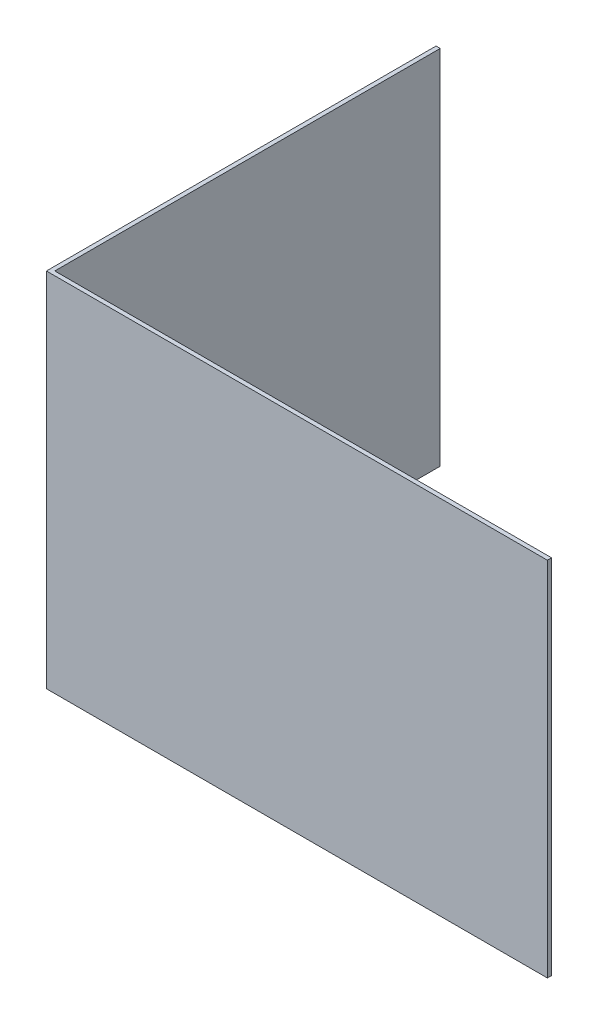
ISO-10303-21;
HEADER;
FILE_DESCRIPTION(('STEP AP214'),'2;1');
FILE_NAME('part.step','',(''),(''),'','','');
FILE_SCHEMA(('AUTOMOTIVE_DESIGN { 1 0 10303 214 1 1 1 1 }'));
ENDSEC;
DATA;
#1=APPLICATION_CONTEXT('core data for automotive mechanical design processes');
#2=APPLICATION_PROTOCOL_DEFINITION('international standard','automotive_design',2000,#1);
#3=PRODUCT_CONTEXT('',#1,'mechanical');
#4=PRODUCT('Part','Part','',(#3));
#5=PRODUCT_RELATED_PRODUCT_CATEGORY('part','',(#4));
#6=PRODUCT_DEFINITION_FORMATION('','',#4);
#7=PRODUCT_DEFINITION_CONTEXT('part definition',#1,'design');
#8=PRODUCT_DEFINITION('design','',#6,#7);
#9=PRODUCT_DEFINITION_SHAPE('','',#8);
#10=(LENGTH_UNIT() NAMED_UNIT(*) SI_UNIT(.MILLI.,.METRE.));
#11=(NAMED_UNIT(*) PLANE_ANGLE_UNIT() SI_UNIT($,.RADIAN.));
#12=(NAMED_UNIT(*) SI_UNIT($,.STERADIAN.) SOLID_ANGLE_UNIT());
#13=UNCERTAINTY_MEASURE_WITH_UNIT(LENGTH_MEASURE(1.E-05),#10,'distance_accuracy_value','');
#14=(GEOMETRIC_REPRESENTATION_CONTEXT(3) GLOBAL_UNCERTAINTY_ASSIGNED_CONTEXT((#13)) GLOBAL_UNIT_ASSIGNED_CONTEXT((#10,
#11,#12)) REPRESENTATION_CONTEXT('',''));
#15=CARTESIAN_POINT('',(0.,0.,0.));
#16=DIRECTION('',(0.,0.,1.));
#17=DIRECTION('',(1.,0.,0.));
#18=AXIS2_PLACEMENT_3D('',#15,#16,#17);
#19=CARTESIAN_POINT('',(-47.7659912562796,130.,-15.4658457131801));
#20=DIRECTION('',(0.,0.,1.));
#21=DIRECTION('',(1.,0.,0.));
#22=AXIS2_PLACEMENT_3D('',#19,#20,#21);
#23=PLANE('',#22);
#24=DIRECTION('',(-1.,0.,0.));
#25=VECTOR('',#24,1.);
#26=CARTESIAN_POINT('',(-47.7659912562796,0.,-15.4658457131801));
#27=LINE('',#26,#25);
#28=CARTESIAN_POINT('',(-47.7659912562796,0.,-15.4658457131801));
#29=VERTEX_POINT('',#28);
#30=CARTESIAN_POINT('',(-49.2659912562796,0.,-15.4658457131801));
#31=VERTEX_POINT('',#30);
#32=EDGE_CURVE('E138',#29,#31,#27,.T.);
#33=ORIENTED_EDGE('',*,*,#32,.T.);
#34=DIRECTION('',(0.,-1.,0.));
#35=VECTOR('',#34,1.);
#36=CARTESIAN_POINT('',(-49.2659912562796,130.,-15.4658457131801));
#37=LINE('',#36,#35);
#38=CARTESIAN_POINT('',(-49.2659912562796,130.,-15.4658457131801));
#39=VERTEX_POINT('',#38);
#40=EDGE_CURVE('E11',#39,#31,#37,.T.);
#41=ORIENTED_EDGE('',*,*,#40,.F.);
#42=DIRECTION('',(-1.,0.,0.));
#43=VECTOR('',#42,1.);
#44=CARTESIAN_POINT('',(-47.7659912562796,130.,-15.4658457131801));
#45=LINE('',#44,#43);
#46=CARTESIAN_POINT('',(-47.7659912562796,130.,-15.4658457131801));
#47=VERTEX_POINT('',#46);
#48=EDGE_CURVE('E154',#47,#39,#45,.T.);
#49=ORIENTED_EDGE('',*,*,#48,.F.);
#50=DIRECTION('',(0.,-1.,0.));
#51=VECTOR('',#50,1.);
#52=CARTESIAN_POINT('',(-47.7659912562796,130.,-15.4658457131801));
#53=LINE('',#52,#51);
#54=EDGE_CURVE('E134',#47,#29,#53,.T.);
#55=ORIENTED_EDGE('',*,*,#54,.T.);
#56=EDGE_LOOP('',(#33,#41,#49,#55));
#57=FACE_BOUND('',#56,.T.);
#58=ADVANCED_FACE('F49',(#57),#23,.F.);
#59=CARTESIAN_POINT('',(-49.2659912562796,130.,-15.4658457131801));
#60=DIRECTION('',(1.,0.,0.));
#61=DIRECTION('',(0.,0.,-1.));
#62=AXIS2_PLACEMENT_3D('',#59,#60,#61);
#63=PLANE('',#62);
#64=DIRECTION('',(0.,0.,1.));
#65=VECTOR('',#64,1.);
#66=CARTESIAN_POINT('',(-49.2659912562796,0.,-15.4658457131801));
#67=LINE('',#66,#65);
#68=CARTESIAN_POINT('',(-49.2659912562796,0.,124.53415428682));
#69=VERTEX_POINT('',#68);
#70=EDGE_CURVE('E142',#31,#69,#67,.T.);
#71=ORIENTED_EDGE('',*,*,#70,.T.);
#72=DIRECTION('',(0.,-1.,0.));
#73=VECTOR('',#72,1.);
#74=CARTESIAN_POINT('',(-49.2659912562796,130.,124.53415428682));
#75=LINE('',#74,#73);
#76=CARTESIAN_POINT('',(-49.2659912562796,130.,124.53415428682));
#77=VERTEX_POINT('',#76);
#78=EDGE_CURVE('E58',#77,#69,#75,.T.);
#79=ORIENTED_EDGE('',*,*,#78,.F.);
#80=DIRECTION('',(0.,0.,1.));
#81=VECTOR('',#80,1.);
#82=CARTESIAN_POINT('',(-49.2659912562796,130.,-15.4658457131801));
#83=LINE('',#82,#81);
#84=EDGE_CURVE('E103',#39,#77,#83,.T.);
#85=ORIENTED_EDGE('',*,*,#84,.F.);
#86=ORIENTED_EDGE('',*,*,#40,.T.);
#87=EDGE_LOOP('',(#71,#79,#85,#86));
#88=FACE_BOUND('',#87,.T.);
#89=ADVANCED_FACE('F182',(#88),#63,.F.);
#90=CARTESIAN_POINT('',(-49.2659912562796,130.,124.53415428682));
#91=DIRECTION('',(0.,0.,-1.));
#92=DIRECTION('',(-1.,0.,0.));
#93=AXIS2_PLACEMENT_3D('',#90,#91,#92);
#94=PLANE('',#93);
#95=DIRECTION('',(1.,0.,0.));
#96=VECTOR('',#95,1.);
#97=CARTESIAN_POINT('',(-49.2659912562796,0.,124.53415428682));
#98=LINE('',#97,#96);
#99=CARTESIAN_POINT('',(130.73400874372,0.,124.53415428682));
#100=VERTEX_POINT('',#99);
#101=EDGE_CURVE('E145',#69,#100,#98,.T.);
#102=ORIENTED_EDGE('',*,*,#101,.T.);
#103=DIRECTION('',(0.,-1.,0.));
#104=VECTOR('',#103,1.);
#105=CARTESIAN_POINT('',(130.73400874372,130.,124.53415428682));
#106=LINE('',#105,#104);
#107=CARTESIAN_POINT('',(130.73400874372,130.,124.53415428682));
#108=VERTEX_POINT('',#107);
#109=EDGE_CURVE('E127',#108,#100,#106,.T.);
#110=ORIENTED_EDGE('',*,*,#109,.F.);
#111=DIRECTION('',(1.,0.,0.));
#112=VECTOR('',#111,1.);
#113=CARTESIAN_POINT('',(-49.2659912562796,130.,124.53415428682));
#114=LINE('',#113,#112);
#115=EDGE_CURVE('E116',#77,#108,#114,.T.);
#116=ORIENTED_EDGE('',*,*,#115,.F.);
#117=ORIENTED_EDGE('',*,*,#78,.T.);
#118=EDGE_LOOP('',(#102,#110,#116,#117));
#119=FACE_BOUND('',#118,.T.);
#120=ADVANCED_FACE('F164',(#119),#94,.F.);
#121=CARTESIAN_POINT('',(130.73400874372,130.,124.53415428682));
#122=DIRECTION('',(-1.,0.,0.));
#123=DIRECTION('',(0.,0.,1.));
#124=AXIS2_PLACEMENT_3D('',#121,#122,#123);
#125=PLANE('',#124);
#126=DIRECTION('',(0.,0.,-1.));
#127=VECTOR('',#126,1.);
#128=CARTESIAN_POINT('',(130.73400874372,0.,124.53415428682));
#129=LINE('',#128,#127);
#130=CARTESIAN_POINT('',(130.73400874372,0.,123.03415428682));
#131=VERTEX_POINT('',#130);
#132=EDGE_CURVE('E125',#100,#131,#129,.T.);
#133=ORIENTED_EDGE('',*,*,#132,.T.);
#134=DIRECTION('',(0.,-1.,0.));
#135=VECTOR('',#134,1.);
#136=CARTESIAN_POINT('',(130.73400874372,130.,123.03415428682));
#137=LINE('',#136,#135);
#138=CARTESIAN_POINT('',(130.73400874372,130.,123.03415428682));
#139=VERTEX_POINT('',#138);
#140=EDGE_CURVE('E122',#139,#131,#137,.T.);
#141=ORIENTED_EDGE('',*,*,#140,.F.);
#142=DIRECTION('',(0.,0.,-1.));
#143=VECTOR('',#142,1.);
#144=CARTESIAN_POINT('',(130.73400874372,130.,124.53415428682));
#145=LINE('',#144,#143);
#146=EDGE_CURVE('E110',#108,#139,#145,.T.);
#147=ORIENTED_EDGE('',*,*,#146,.F.);
#148=ORIENTED_EDGE('',*,*,#109,.T.);
#149=EDGE_LOOP('',(#133,#141,#147,#148));
#150=FACE_BOUND('',#149,.T.);
#151=ADVANCED_FACE('F123',(#150),#125,.F.);
#152=CARTESIAN_POINT('',(130.73400874372,130.,123.03415428682));
#153=DIRECTION('',(0.,0.,1.));
#154=DIRECTION('',(1.,0.,0.));
#155=AXIS2_PLACEMENT_3D('',#152,#153,#154);
#156=PLANE('',#155);
#157=DIRECTION('',(-1.,0.,0.));
#158=VECTOR('',#157,1.);
#159=CARTESIAN_POINT('',(130.73400874372,0.,123.03415428682));
#160=LINE('',#159,#158);
#161=CARTESIAN_POINT('',(-47.7659912562796,0.,123.03415428682));
#162=VERTEX_POINT('',#161);
#163=EDGE_CURVE('E89',#131,#162,#160,.T.);
#164=ORIENTED_EDGE('',*,*,#163,.T.);
#165=DIRECTION('',(0.,-1.,0.));
#166=VECTOR('',#165,1.);
#167=CARTESIAN_POINT('',(-47.7659912562796,130.,123.03415428682));
#168=LINE('',#167,#166);
#169=CARTESIAN_POINT('',(-47.7659912562796,130.,123.03415428682));
#170=VERTEX_POINT('',#169);
#171=EDGE_CURVE('E128',#170,#162,#168,.T.);
#172=ORIENTED_EDGE('',*,*,#171,.F.);
#173=DIRECTION('',(-1.,0.,0.));
#174=VECTOR('',#173,1.);
#175=CARTESIAN_POINT('',(130.73400874372,130.,123.03415428682));
#176=LINE('',#175,#174);
#177=EDGE_CURVE('E114',#139,#170,#176,.T.);
#178=ORIENTED_EDGE('',*,*,#177,.F.);
#179=ORIENTED_EDGE('',*,*,#140,.T.);
#180=EDGE_LOOP('',(#164,#172,#178,#179));
#181=FACE_BOUND('',#180,.T.);
#182=ADVANCED_FACE('F130',(#181),#156,.F.);
#183=CARTESIAN_POINT('',(-47.7659912562796,130.,123.03415428682));
#184=DIRECTION('',(-1.,0.,0.));
#185=DIRECTION('',(0.,0.,1.));
#186=AXIS2_PLACEMENT_3D('',#183,#184,#185);
#187=PLANE('',#186);
#188=DIRECTION('',(0.,0.,-1.));
#189=VECTOR('',#188,1.);
#190=CARTESIAN_POINT('',(-47.7659912562796,0.,123.03415428682));
#191=LINE('',#190,#189);
#192=EDGE_CURVE('E95',#162,#29,#191,.T.);
#193=ORIENTED_EDGE('',*,*,#192,.T.);
#194=ORIENTED_EDGE('',*,*,#54,.F.);
#195=DIRECTION('',(0.,0.,-1.));
#196=VECTOR('',#195,1.);
#197=CARTESIAN_POINT('',(-47.7659912562796,130.,123.03415428682));
#198=LINE('',#197,#196);
#199=EDGE_CURVE('E66',#170,#47,#198,.T.);
#200=ORIENTED_EDGE('',*,*,#199,.F.);
#201=ORIENTED_EDGE('',*,*,#171,.T.);
#202=EDGE_LOOP('',(#193,#194,#200,#201));
#203=FACE_BOUND('',#202,.T.);
#204=ADVANCED_FACE('F171',(#203),#187,.F.);
#205=CARTESIAN_POINT('',(0.,130.,0.));
#206=DIRECTION('',(0.,1.,0.));
#207=DIRECTION('',(0.,0.,1.));
#208=AXIS2_PLACEMENT_3D('',#205,#206,#207);
#209=PLANE('',#208);
#210=ORIENTED_EDGE('',*,*,#48,.T.);
#211=ORIENTED_EDGE('',*,*,#84,.T.);
#212=ORIENTED_EDGE('',*,*,#115,.T.);
#213=ORIENTED_EDGE('',*,*,#146,.T.);
#214=ORIENTED_EDGE('',*,*,#177,.T.);
#215=ORIENTED_EDGE('',*,*,#199,.T.);
#216=EDGE_LOOP('',(#210,#211,#212,#213,#214,#215));
#217=FACE_BOUND('',#216,.T.);
#218=ADVANCED_FACE('F112',(#217),#209,.T.);
#219=CARTESIAN_POINT('',(0.,0.,0.));
#220=DIRECTION('',(0.,1.,0.));
#221=DIRECTION('',(0.,0.,1.));
#222=AXIS2_PLACEMENT_3D('',#219,#220,#221);
#223=PLANE('',#222);
#224=ORIENTED_EDGE('',*,*,#32,.F.);
#225=ORIENTED_EDGE('',*,*,#192,.F.);
#226=ORIENTED_EDGE('',*,*,#163,.F.);
#227=ORIENTED_EDGE('',*,*,#132,.F.);
#228=ORIENTED_EDGE('',*,*,#101,.F.);
#229=ORIENTED_EDGE('',*,*,#70,.F.);
#230=EDGE_LOOP('',(#224,#225,#226,#227,#228,#229));
#231=FACE_BOUND('',#230,.T.);
#232=ADVANCED_FACE('F167',(#231),#223,.F.);
#233=CLOSED_SHELL('',(#58,#89,#120,#151,#182,#204,#218,#232));
#234=MANIFOLD_SOLID_BREP('B2',#233);
#235=ADVANCED_BREP_SHAPE_REPRESENTATION('',(#18,#234),#14);
#236=SHAPE_DEFINITION_REPRESENTATION(#9,#235);
ENDSEC;
END-ISO-10303-21;
